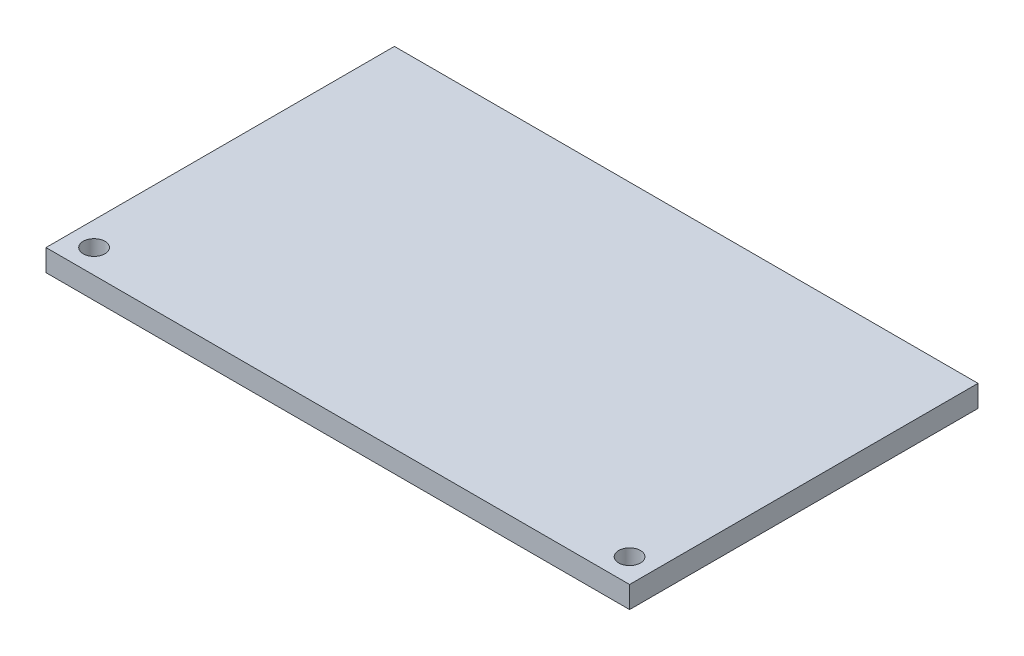
ISO-10303-21;
HEADER;
FILE_DESCRIPTION(('STEP AP214'),'2;1');
FILE_NAME('part.step','',(''),(''),'','','');
FILE_SCHEMA(('AUTOMOTIVE_DESIGN { 1 0 10303 214 1 1 1 1 }'));
ENDSEC;
DATA;
#1=APPLICATION_CONTEXT('core data for automotive mechanical design processes');
#2=APPLICATION_PROTOCOL_DEFINITION('international standard','automotive_design',2000,#1);
#3=PRODUCT_CONTEXT('',#1,'mechanical');
#4=PRODUCT('Part','Part','',(#3));
#5=PRODUCT_RELATED_PRODUCT_CATEGORY('part','',(#4));
#6=PRODUCT_DEFINITION_FORMATION('','',#4);
#7=PRODUCT_DEFINITION_CONTEXT('part definition',#1,'design');
#8=PRODUCT_DEFINITION('design','',#6,#7);
#9=PRODUCT_DEFINITION_SHAPE('','',#8);
#10=(LENGTH_UNIT() NAMED_UNIT(*) SI_UNIT(.MILLI.,.METRE.));
#11=(NAMED_UNIT(*) PLANE_ANGLE_UNIT() SI_UNIT($,.RADIAN.));
#12=(NAMED_UNIT(*) SI_UNIT($,.STERADIAN.) SOLID_ANGLE_UNIT());
#13=UNCERTAINTY_MEASURE_WITH_UNIT(LENGTH_MEASURE(1.E-05),#10,'distance_accuracy_value','');
#14=(GEOMETRIC_REPRESENTATION_CONTEXT(3) GLOBAL_UNCERTAINTY_ASSIGNED_CONTEXT((#13)) GLOBAL_UNIT_ASSIGNED_CONTEXT((#10,
#11,#12)) REPRESENTATION_CONTEXT('',''));
#15=CARTESIAN_POINT('',(0.,0.,0.));
#16=DIRECTION('',(0.,0.,1.));
#17=DIRECTION('',(1.,0.,0.));
#18=AXIS2_PLACEMENT_3D('',#15,#16,#17);
#19=CARTESIAN_POINT('',(0.,3.175,0.));
#20=DIRECTION('',(0.,-1.,0.));
#21=DIRECTION('',(0.,0.,-1.));
#22=AXIS2_PLACEMENT_3D('',#19,#20,#21);
#23=PLANE('',#22);
#24=DIRECTION('',(0.,0.,1.));
#25=VECTOR('',#24,1.);
#26=CARTESIAN_POINT('',(0.,3.175,0.));
#27=LINE('',#26,#25);
#28=CARTESIAN_POINT('',(0.,3.175,-50.8));
#29=VERTEX_POINT('',#28);
#30=CARTESIAN_POINT('',(0.,3.175,0.));
#31=VERTEX_POINT('',#30);
#32=EDGE_CURVE('E85',#29,#31,#27,.T.);
#33=ORIENTED_EDGE('',*,*,#32,.T.);
#34=DIRECTION('',(1.,0.,0.));
#35=VECTOR('',#34,1.);
#36=CARTESIAN_POINT('',(0.,3.175,0.));
#37=LINE('',#36,#35);
#38=CARTESIAN_POINT('',(85.09,3.175,0.));
#39=VERTEX_POINT('',#38);
#40=EDGE_CURVE('E80',#31,#39,#37,.T.);
#41=ORIENTED_EDGE('',*,*,#40,.T.);
#42=DIRECTION('',(0.,0.,-1.));
#43=VECTOR('',#42,1.);
#44=CARTESIAN_POINT('',(85.09,3.175,0.));
#45=LINE('',#44,#43);
#46=CARTESIAN_POINT('',(85.09,3.175,-50.8));
#47=VERTEX_POINT('',#46);
#48=EDGE_CURVE('E83',#39,#47,#45,.T.);
#49=ORIENTED_EDGE('',*,*,#48,.T.);
#50=DIRECTION('',(-1.,0.,0.));
#51=VECTOR('',#50,1.);
#52=CARTESIAN_POINT('',(0.,3.175,-50.8));
#53=LINE('',#52,#51);
#54=EDGE_CURVE('E50',#47,#29,#53,.T.);
#55=ORIENTED_EDGE('',*,*,#54,.T.);
#56=EDGE_LOOP('',(#33,#41,#49,#55));
#57=FACE_BOUND('',#56,.T.);
#58=CARTESIAN_POINT('',(3.5052,3.175,-3.5052));
#59=DIRECTION('',(0.,1.,0.));
#60=DIRECTION('',(0.,0.,1.));
#61=AXIS2_PLACEMENT_3D('',#58,#59,#60);
#62=CIRCLE('',#61,1.5875);
#63=CARTESIAN_POINT('',(3.5052,3.175,-1.9177));
#64=VERTEX_POINT('',#63);
#65=EDGE_CURVE('E100',#64,#64,#62,.T.);
#66=ORIENTED_EDGE('',*,*,#65,.F.);
#67=EDGE_LOOP('',(#66));
#68=FACE_BOUND('',#67,.T.);
#69=CARTESIAN_POINT('',(81.5848,3.175,-3.5052));
#70=DIRECTION('',(0.,1.,0.));
#71=DIRECTION('',(0.,0.,1.));
#72=AXIS2_PLACEMENT_3D('',#69,#70,#71);
#73=CIRCLE('',#72,1.5875);
#74=CARTESIAN_POINT('',(81.5848,3.175,-1.9177));
#75=VERTEX_POINT('',#74);
#76=EDGE_CURVE('E115',#75,#75,#73,.T.);
#77=ORIENTED_EDGE('',*,*,#76,.F.);
#78=EDGE_LOOP('',(#77));
#79=FACE_BOUND('',#78,.T.);
#80=ADVANCED_FACE('F33',(#57,#68,#79),#23,.F.);
#81=CARTESIAN_POINT('',(0.,0.,0.));
#82=DIRECTION('',(0.,-1.,0.));
#83=DIRECTION('',(0.,0.,-1.));
#84=AXIS2_PLACEMENT_3D('',#81,#82,#83);
#85=PLANE('',#84);
#86=CARTESIAN_POINT('',(3.5052,0.,-3.5052));
#87=DIRECTION('',(0.,1.,0.));
#88=DIRECTION('',(0.,0.,1.));
#89=AXIS2_PLACEMENT_3D('',#86,#87,#88);
#90=CIRCLE('',#89,1.5875);
#91=CARTESIAN_POINT('',(3.5052,0.,-1.9177));
#92=VERTEX_POINT('',#91);
#93=EDGE_CURVE('E112',#92,#92,#90,.T.);
#94=ORIENTED_EDGE('',*,*,#93,.T.);
#95=EDGE_LOOP('',(#94));
#96=FACE_BOUND('',#95,.T.);
#97=DIRECTION('',(0.,0.,1.));
#98=VECTOR('',#97,1.);
#99=CARTESIAN_POINT('',(0.,0.,0.));
#100=LINE('',#99,#98);
#101=CARTESIAN_POINT('',(0.,0.,-50.8));
#102=VERTEX_POINT('',#101);
#103=CARTESIAN_POINT('',(0.,0.,0.));
#104=VERTEX_POINT('',#103);
#105=EDGE_CURVE('E97',#102,#104,#100,.T.);
#106=ORIENTED_EDGE('',*,*,#105,.F.);
#107=DIRECTION('',(-1.,0.,0.));
#108=VECTOR('',#107,1.);
#109=CARTESIAN_POINT('',(0.,0.,-50.8));
#110=LINE('',#109,#108);
#111=CARTESIAN_POINT('',(85.09,0.,-50.8));
#112=VERTEX_POINT('',#111);
#113=EDGE_CURVE('E73',#112,#102,#110,.T.);
#114=ORIENTED_EDGE('',*,*,#113,.F.);
#115=DIRECTION('',(0.,0.,-1.));
#116=VECTOR('',#115,1.);
#117=CARTESIAN_POINT('',(85.09,0.,0.));
#118=LINE('',#117,#116);
#119=CARTESIAN_POINT('',(85.09,0.,0.));
#120=VERTEX_POINT('',#119);
#121=EDGE_CURVE('E67',#120,#112,#118,.T.);
#122=ORIENTED_EDGE('',*,*,#121,.F.);
#123=DIRECTION('',(1.,0.,0.));
#124=VECTOR('',#123,1.);
#125=CARTESIAN_POINT('',(0.,0.,0.));
#126=LINE('',#125,#124);
#127=EDGE_CURVE('E89',#104,#120,#126,.T.);
#128=ORIENTED_EDGE('',*,*,#127,.F.);
#129=EDGE_LOOP('',(#106,#114,#122,#128));
#130=FACE_BOUND('',#129,.T.);
#131=CARTESIAN_POINT('',(81.5848,0.,-3.5052));
#132=DIRECTION('',(0.,1.,0.));
#133=DIRECTION('',(0.,0.,1.));
#134=AXIS2_PLACEMENT_3D('',#131,#132,#133);
#135=CIRCLE('',#134,1.5875);
#136=CARTESIAN_POINT('',(81.5848,0.,-1.9177));
#137=VERTEX_POINT('',#136);
#138=EDGE_CURVE('E118',#137,#137,#135,.T.);
#139=ORIENTED_EDGE('',*,*,#138,.T.);
#140=EDGE_LOOP('',(#139));
#141=FACE_BOUND('',#140,.T.);
#142=ADVANCED_FACE('F108',(#96,#130,#141),#85,.T.);
#143=CARTESIAN_POINT('',(0.,3.175,0.));
#144=DIRECTION('',(1.,0.,0.));
#145=DIRECTION('',(0.,0.,-1.));
#146=AXIS2_PLACEMENT_3D('',#143,#144,#145);
#147=PLANE('',#146);
#148=ORIENTED_EDGE('',*,*,#105,.T.);
#149=DIRECTION('',(0.,-1.,0.));
#150=VECTOR('',#149,1.);
#151=CARTESIAN_POINT('',(0.,3.175,0.));
#152=LINE('',#151,#150);
#153=EDGE_CURVE('E11',#31,#104,#152,.T.);
#154=ORIENTED_EDGE('',*,*,#153,.F.);
#155=ORIENTED_EDGE('',*,*,#32,.F.);
#156=DIRECTION('',(0.,-1.,0.));
#157=VECTOR('',#156,1.);
#158=CARTESIAN_POINT('',(0.,3.175,-50.8));
#159=LINE('',#158,#157);
#160=EDGE_CURVE('E93',#29,#102,#159,.T.);
#161=ORIENTED_EDGE('',*,*,#160,.T.);
#162=EDGE_LOOP('',(#148,#154,#155,#161));
#163=FACE_BOUND('',#162,.T.);
#164=ADVANCED_FACE('F35',(#163),#147,.F.);
#165=CARTESIAN_POINT('',(0.,3.175,0.));
#166=DIRECTION('',(0.,0.,-1.));
#167=DIRECTION('',(-1.,0.,0.));
#168=AXIS2_PLACEMENT_3D('',#165,#166,#167);
#169=PLANE('',#168);
#170=ORIENTED_EDGE('',*,*,#127,.T.);
#171=DIRECTION('',(0.,-1.,0.));
#172=VECTOR('',#171,1.);
#173=CARTESIAN_POINT('',(85.09,3.175,0.));
#174=LINE('',#173,#172);
#175=EDGE_CURVE('E42',#39,#120,#174,.T.);
#176=ORIENTED_EDGE('',*,*,#175,.F.);
#177=ORIENTED_EDGE('',*,*,#40,.F.);
#178=ORIENTED_EDGE('',*,*,#153,.T.);
#179=EDGE_LOOP('',(#170,#176,#177,#178));
#180=FACE_BOUND('',#179,.T.);
#181=ADVANCED_FACE('F88',(#180),#169,.F.);
#182=CARTESIAN_POINT('',(85.09,3.175,0.));
#183=DIRECTION('',(-1.,0.,0.));
#184=DIRECTION('',(0.,0.,1.));
#185=AXIS2_PLACEMENT_3D('',#182,#183,#184);
#186=PLANE('',#185);
#187=ORIENTED_EDGE('',*,*,#121,.T.);
#188=DIRECTION('',(0.,-1.,0.));
#189=VECTOR('',#188,1.);
#190=CARTESIAN_POINT('',(85.09,3.175,-50.8));
#191=LINE('',#190,#189);
#192=EDGE_CURVE('E90',#47,#112,#191,.T.);
#193=ORIENTED_EDGE('',*,*,#192,.F.);
#194=ORIENTED_EDGE('',*,*,#48,.F.);
#195=ORIENTED_EDGE('',*,*,#175,.T.);
#196=EDGE_LOOP('',(#187,#193,#194,#195));
#197=FACE_BOUND('',#196,.T.);
#198=ADVANCED_FACE('F91',(#197),#186,.F.);
#199=CARTESIAN_POINT('',(0.,3.175,-50.8));
#200=DIRECTION('',(0.,0.,1.));
#201=DIRECTION('',(1.,0.,0.));
#202=AXIS2_PLACEMENT_3D('',#199,#200,#201);
#203=PLANE('',#202);
#204=ORIENTED_EDGE('',*,*,#113,.T.);
#205=ORIENTED_EDGE('',*,*,#160,.F.);
#206=ORIENTED_EDGE('',*,*,#54,.F.);
#207=ORIENTED_EDGE('',*,*,#192,.T.);
#208=EDGE_LOOP('',(#204,#205,#206,#207));
#209=FACE_BOUND('',#208,.T.);
#210=ADVANCED_FACE('F105',(#209),#203,.F.);
#211=CARTESIAN_POINT('',(3.5052,3.175,-3.5052));
#212=DIRECTION('',(0.,-1.,0.));
#213=DIRECTION('',(0.,0.,-1.));
#214=AXIS2_PLACEMENT_3D('',#211,#212,#213);
#215=CYLINDRICAL_SURFACE('',#214,1.5875);
#216=ORIENTED_EDGE('',*,*,#65,.T.);
#217=EDGE_LOOP('',(#216));
#218=FACE_BOUND('',#217,.T.);
#219=ORIENTED_EDGE('',*,*,#93,.F.);
#220=EDGE_LOOP('',(#219));
#221=FACE_BOUND('',#220,.T.);
#222=ADVANCED_FACE('F135',(#218,#221),#215,.F.);
#223=CARTESIAN_POINT('',(81.5848,3.175,-3.5052));
#224=DIRECTION('',(0.,-1.,0.));
#225=DIRECTION('',(0.,0.,-1.));
#226=AXIS2_PLACEMENT_3D('',#223,#224,#225);
#227=CYLINDRICAL_SURFACE('',#226,1.5875);
#228=ORIENTED_EDGE('',*,*,#76,.T.);
#229=EDGE_LOOP('',(#228));
#230=FACE_BOUND('',#229,.T.);
#231=ORIENTED_EDGE('',*,*,#138,.F.);
#232=EDGE_LOOP('',(#231));
#233=FACE_BOUND('',#232,.T.);
#234=ADVANCED_FACE('F124',(#230,#233),#227,.F.);
#235=CLOSED_SHELL('',(#80,#142,#164,#181,#198,#210,#222,#234));
#236=MANIFOLD_SOLID_BREP('B2',#235);
#237=ADVANCED_BREP_SHAPE_REPRESENTATION('',(#18,#236),#14);
#238=SHAPE_DEFINITION_REPRESENTATION(#9,#237);
ENDSEC;
END-ISO-10303-21;
